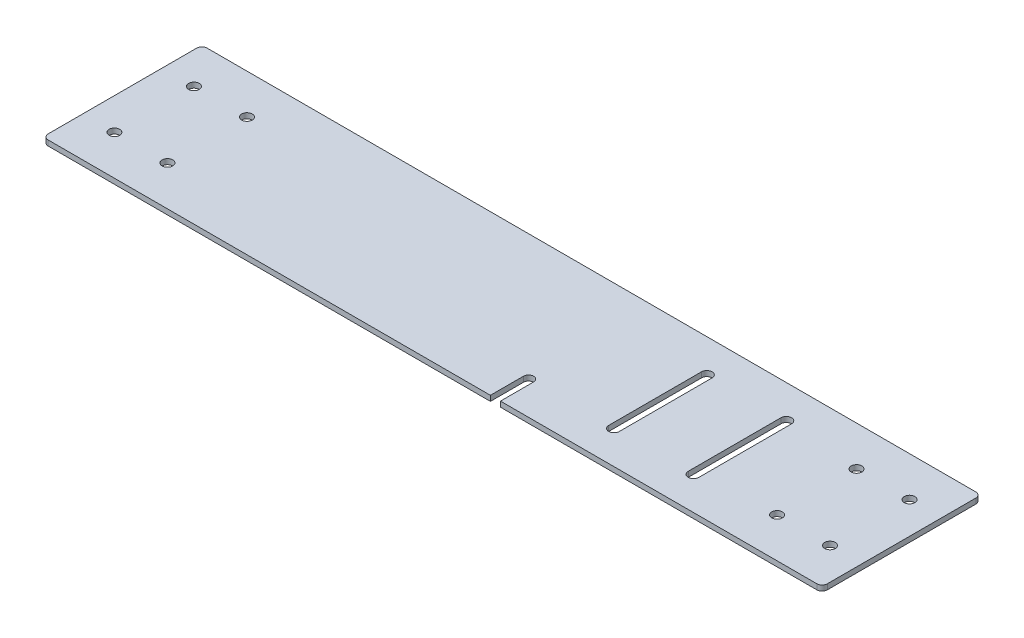
ISO-10303-21;
HEADER;
FILE_DESCRIPTION(('STEP AP214'),'2;1');
FILE_NAME('part.step','',(''),(''),'','','');
FILE_SCHEMA(('AUTOMOTIVE_DESIGN { 1 0 10303 214 1 1 1 1 }'));
ENDSEC;
DATA;
#1=APPLICATION_CONTEXT('core data for automotive mechanical design processes');
#2=APPLICATION_PROTOCOL_DEFINITION('international standard','automotive_design',2000,#1);
#3=PRODUCT_CONTEXT('',#1,'mechanical');
#4=PRODUCT('Part','Part','',(#3));
#5=PRODUCT_RELATED_PRODUCT_CATEGORY('part','',(#4));
#6=PRODUCT_DEFINITION_FORMATION('','',#4);
#7=PRODUCT_DEFINITION_CONTEXT('part definition',#1,'design');
#8=PRODUCT_DEFINITION('design','',#6,#7);
#9=PRODUCT_DEFINITION_SHAPE('','',#8);
#10=(LENGTH_UNIT() NAMED_UNIT(*) SI_UNIT(.MILLI.,.METRE.));
#11=(NAMED_UNIT(*) PLANE_ANGLE_UNIT() SI_UNIT($,.RADIAN.));
#12=(NAMED_UNIT(*) SI_UNIT($,.STERADIAN.) SOLID_ANGLE_UNIT());
#13=UNCERTAINTY_MEASURE_WITH_UNIT(LENGTH_MEASURE(1.E-05),#10,'distance_accuracy_value','');
#14=(GEOMETRIC_REPRESENTATION_CONTEXT(3) GLOBAL_UNCERTAINTY_ASSIGNED_CONTEXT((#13)) GLOBAL_UNIT_ASSIGNED_CONTEXT((#10,
#11,#12)) REPRESENTATION_CONTEXT('',''));
#15=CARTESIAN_POINT('',(0.,0.,0.));
#16=DIRECTION('',(0.,0.,1.));
#17=DIRECTION('',(1.,0.,0.));
#18=AXIS2_PLACEMENT_3D('',#15,#16,#17);
#19=CARTESIAN_POINT('',(0.,2.,30.));
#20=DIRECTION('',(0.,0.,-1.));
#21=DIRECTION('',(-1.,0.,0.));
#22=AXIS2_PLACEMENT_3D('',#19,#20,#21);
#23=PLANE('',#22);
#24=DIRECTION('',(1.,0.,0.));
#25=VECTOR('',#24,1.);
#26=CARTESIAN_POINT('',(0.,0.,30.));
#27=LINE('',#26,#25);
#28=CARTESIAN_POINT('',(-145.,0.,30.));
#29=VERTEX_POINT('',#28);
#30=CARTESIAN_POINT('',(21.85,0.,30.));
#31=VERTEX_POINT('',#30);
#32=EDGE_CURVE('E301',#29,#31,#27,.T.);
#33=ORIENTED_EDGE('',*,*,#32,.T.);
#34=DIRECTION('',(0.,-1.,0.));
#35=VECTOR('',#34,1.);
#36=CARTESIAN_POINT('',(21.85,-8.,30.));
#37=LINE('',#36,#35);
#38=CARTESIAN_POINT('',(21.85,2.,30.));
#39=VERTEX_POINT('',#38);
#40=EDGE_CURVE('E199',#39,#31,#37,.T.);
#41=ORIENTED_EDGE('',*,*,#40,.F.);
#42=DIRECTION('',(1.,0.,0.));
#43=VECTOR('',#42,1.);
#44=CARTESIAN_POINT('',(0.,2.,30.));
#45=LINE('',#44,#43);
#46=CARTESIAN_POINT('',(-145.,2.,30.));
#47=VERTEX_POINT('',#46);
#48=EDGE_CURVE('E190',#47,#39,#45,.T.);
#49=ORIENTED_EDGE('',*,*,#48,.F.);
#50=DIRECTION('',(0.,-1.,0.));
#51=VECTOR('',#50,1.);
#52=CARTESIAN_POINT('',(-145.,2.,30.));
#53=LINE('',#52,#51);
#54=EDGE_CURVE('E385',#47,#29,#53,.T.);
#55=ORIENTED_EDGE('',*,*,#54,.T.);
#56=EDGE_LOOP('',(#33,#41,#49,#55));
#57=FACE_BOUND('',#56,.T.);
#58=ADVANCED_FACE('F45',(#57),#23,.F.);
#59=CARTESIAN_POINT('',(0.,2.,30.));
#60=DIRECTION('',(0.,0.,-1.));
#61=DIRECTION('',(-1.,0.,0.));
#62=AXIS2_PLACEMENT_3D('',#59,#60,#61);
#63=PLANE('',#62);
#64=DIRECTION('',(0.,-1.,0.));
#65=VECTOR('',#64,1.);
#66=CARTESIAN_POINT('',(145.,2.,30.));
#67=LINE('',#66,#65);
#68=CARTESIAN_POINT('',(145.,0.,30.));
#69=VERTEX_POINT('',#68);
#70=CARTESIAN_POINT('',(145.,2.,30.));
#71=VERTEX_POINT('',#70);
#72=EDGE_CURVE('E11',#69,#71,#67,.F.);
#73=ORIENTED_EDGE('',*,*,#72,.T.);
#74=DIRECTION('',(1.,0.,0.));
#75=VECTOR('',#74,1.);
#76=CARTESIAN_POINT('',(0.,2.,30.));
#77=LINE('',#76,#75);
#78=CARTESIAN_POINT('',(25.65,2.,30.));
#79=VERTEX_POINT('',#78);
#80=EDGE_CURVE('E180',#79,#71,#77,.T.);
#81=ORIENTED_EDGE('',*,*,#80,.F.);
#82=DIRECTION('',(0.,1.,0.));
#83=VECTOR('',#82,1.);
#84=CARTESIAN_POINT('',(25.65,-8.,30.));
#85=LINE('',#84,#83);
#86=CARTESIAN_POINT('',(25.65,0.,30.));
#87=VERTEX_POINT('',#86);
#88=EDGE_CURVE('E183',#87,#79,#85,.T.);
#89=ORIENTED_EDGE('',*,*,#88,.F.);
#90=DIRECTION('',(1.,0.,0.));
#91=VECTOR('',#90,1.);
#92=CARTESIAN_POINT('',(0.,0.,30.));
#93=LINE('',#92,#91);
#94=EDGE_CURVE('E304',#87,#69,#93,.T.);
#95=ORIENTED_EDGE('',*,*,#94,.T.);
#96=EDGE_LOOP('',(#73,#81,#89,#95));
#97=FACE_BOUND('',#96,.T.);
#98=ADVANCED_FACE('F182',(#97),#63,.F.);
#99=CARTESIAN_POINT('',(147.,2.,0.));
#100=DIRECTION('',(1.,0.,0.));
#101=DIRECTION('',(0.,0.,-1.));
#102=AXIS2_PLACEMENT_3D('',#99,#100,#101);
#103=PLANE('',#102);
#104=DIRECTION('',(0.,0.,1.));
#105=VECTOR('',#104,1.);
#106=CARTESIAN_POINT('',(147.,0.,0.));
#107=LINE('',#106,#105);
#108=CARTESIAN_POINT('',(147.,0.,-28.));
#109=VERTEX_POINT('',#108);
#110=CARTESIAN_POINT('',(147.,0.,28.));
#111=VERTEX_POINT('',#110);
#112=EDGE_CURVE('E308',#109,#111,#107,.T.);
#113=ORIENTED_EDGE('',*,*,#112,.F.);
#114=DIRECTION('',(0.,-1.,0.));
#115=VECTOR('',#114,1.);
#116=CARTESIAN_POINT('',(147.,2.,-28.));
#117=LINE('',#116,#115);
#118=CARTESIAN_POINT('',(147.,2.,-28.));
#119=VERTEX_POINT('',#118);
#120=EDGE_CURVE('E54',#109,#119,#117,.F.);
#121=ORIENTED_EDGE('',*,*,#120,.T.);
#122=DIRECTION('',(0.,0.,1.));
#123=VECTOR('',#122,1.);
#124=CARTESIAN_POINT('',(147.,2.,0.));
#125=LINE('',#124,#123);
#126=CARTESIAN_POINT('',(147.,2.,28.));
#127=VERTEX_POINT('',#126);
#128=EDGE_CURVE('E189',#119,#127,#125,.T.);
#129=ORIENTED_EDGE('',*,*,#128,.T.);
#130=DIRECTION('',(0.,-1.,0.));
#131=VECTOR('',#130,1.);
#132=CARTESIAN_POINT('',(147.,0.,28.));
#133=LINE('',#132,#131);
#134=EDGE_CURVE('E427',#127,#111,#133,.T.);
#135=ORIENTED_EDGE('',*,*,#134,.T.);
#136=EDGE_LOOP('',(#113,#121,#129,#135));
#137=FACE_BOUND('',#136,.T.);
#138=ADVANCED_FACE('F436',(#137),#103,.T.);
#139=CARTESIAN_POINT('',(0.,2.,-30.));
#140=DIRECTION('',(0.,0.,-1.));
#141=DIRECTION('',(-1.,0.,0.));
#142=AXIS2_PLACEMENT_3D('',#139,#140,#141);
#143=PLANE('',#142);
#144=DIRECTION('',(0.,-1.,0.));
#145=VECTOR('',#144,1.);
#146=CARTESIAN_POINT('',(-145.,2.,-30.));
#147=LINE('',#146,#145);
#148=CARTESIAN_POINT('',(-145.,0.,-30.));
#149=VERTEX_POINT('',#148);
#150=CARTESIAN_POINT('',(-145.,2.,-30.));
#151=VERTEX_POINT('',#150);
#152=EDGE_CURVE('E421',#149,#151,#147,.F.);
#153=ORIENTED_EDGE('',*,*,#152,.T.);
#154=DIRECTION('',(1.,0.,0.));
#155=VECTOR('',#154,1.);
#156=CARTESIAN_POINT('',(0.,2.,-30.));
#157=LINE('',#156,#155);
#158=CARTESIAN_POINT('',(145.,2.,-30.));
#159=VERTEX_POINT('',#158);
#160=EDGE_CURVE('E61',#151,#159,#157,.T.);
#161=ORIENTED_EDGE('',*,*,#160,.T.);
#162=DIRECTION('',(0.,-1.,0.));
#163=VECTOR('',#162,1.);
#164=CARTESIAN_POINT('',(145.,2.,-30.));
#165=LINE('',#164,#163);
#166=CARTESIAN_POINT('',(145.,0.,-30.));
#167=VERTEX_POINT('',#166);
#168=EDGE_CURVE('E424',#159,#167,#165,.T.);
#169=ORIENTED_EDGE('',*,*,#168,.T.);
#170=DIRECTION('',(1.,0.,0.));
#171=VECTOR('',#170,1.);
#172=CARTESIAN_POINT('',(0.,0.,-30.));
#173=LINE('',#172,#171);
#174=EDGE_CURVE('E312',#149,#167,#173,.T.);
#175=ORIENTED_EDGE('',*,*,#174,.F.);
#176=EDGE_LOOP('',(#153,#161,#169,#175));
#177=FACE_BOUND('',#176,.T.);
#178=ADVANCED_FACE('F444',(#177),#143,.T.);
#179=CARTESIAN_POINT('',(-147.,2.,0.));
#180=DIRECTION('',(1.,0.,0.));
#181=DIRECTION('',(0.,0.,-1.));
#182=AXIS2_PLACEMENT_3D('',#179,#180,#181);
#183=PLANE('',#182);
#184=DIRECTION('',(0.,0.,1.));
#185=VECTOR('',#184,1.);
#186=CARTESIAN_POINT('',(-147.,0.,0.));
#187=LINE('',#186,#185);
#188=CARTESIAN_POINT('',(-147.,0.,-28.));
#189=VERTEX_POINT('',#188);
#190=CARTESIAN_POINT('',(-147.,0.,28.));
#191=VERTEX_POINT('',#190);
#192=EDGE_CURVE('E289',#189,#191,#187,.T.);
#193=ORIENTED_EDGE('',*,*,#192,.T.);
#194=DIRECTION('',(0.,-1.,0.));
#195=VECTOR('',#194,1.);
#196=CARTESIAN_POINT('',(-147.,2.,28.));
#197=LINE('',#196,#195);
#198=CARTESIAN_POINT('',(-147.,2.,28.));
#199=VERTEX_POINT('',#198);
#200=EDGE_CURVE('E406',#191,#199,#197,.F.);
#201=ORIENTED_EDGE('',*,*,#200,.T.);
#202=DIRECTION('',(0.,0.,1.));
#203=VECTOR('',#202,1.);
#204=CARTESIAN_POINT('',(-147.,2.,0.));
#205=LINE('',#204,#203);
#206=CARTESIAN_POINT('',(-147.,2.,-28.));
#207=VERTEX_POINT('',#206);
#208=EDGE_CURVE('E296',#207,#199,#205,.T.);
#209=ORIENTED_EDGE('',*,*,#208,.F.);
#210=DIRECTION('',(0.,-1.,0.));
#211=VECTOR('',#210,1.);
#212=CARTESIAN_POINT('',(-147.,0.,-28.));
#213=LINE('',#212,#211);
#214=EDGE_CURVE('E402',#207,#189,#213,.T.);
#215=ORIENTED_EDGE('',*,*,#214,.T.);
#216=EDGE_LOOP('',(#193,#201,#209,#215));
#217=FACE_BOUND('',#216,.T.);
#218=ADVANCED_FACE('F454',(#217),#183,.F.);
#219=CARTESIAN_POINT('',(0.,2.,0.));
#220=DIRECTION('',(0.,1.,0.));
#221=DIRECTION('',(0.,0.,1.));
#222=AXIS2_PLACEMENT_3D('',#219,#220,#221);
#223=PLANE('',#222);
#224=ORIENTED_EDGE('',*,*,#160,.F.);
#225=CARTESIAN_POINT('',(-145.,2.,-28.));
#226=DIRECTION('',(0.,1.,0.));
#227=DIRECTION('',(0.,0.,1.));
#228=AXIS2_PLACEMENT_3D('',#225,#226,#227);
#229=CIRCLE('',#228,2.);
#230=EDGE_CURVE('E415',#151,#207,#229,.T.);
#231=ORIENTED_EDGE('',*,*,#230,.T.);
#232=ORIENTED_EDGE('',*,*,#208,.T.);
#233=CARTESIAN_POINT('',(-145.,2.,28.));
#234=DIRECTION('',(0.,1.,0.));
#235=DIRECTION('',(0.,0.,1.));
#236=AXIS2_PLACEMENT_3D('',#233,#234,#235);
#237=CIRCLE('',#236,2.);
#238=EDGE_CURVE('E418',#199,#47,#237,.T.);
#239=ORIENTED_EDGE('',*,*,#238,.T.);
#240=ORIENTED_EDGE('',*,*,#48,.T.);
#241=DIRECTION('',(0.,0.,1.));
#242=VECTOR('',#241,1.);
#243=CARTESIAN_POINT('',(21.85,2.,17.5));
#244=LINE('',#243,#242);
#245=CARTESIAN_POINT('',(21.85,2.,17.5));
#246=VERTEX_POINT('',#245);
#247=EDGE_CURVE('E207',#246,#39,#244,.T.);
#248=ORIENTED_EDGE('',*,*,#247,.F.);
#249=CARTESIAN_POINT('',(23.75,2.,17.5));
#250=DIRECTION('',(0.,1.,0.));
#251=DIRECTION('',(0.,0.,1.));
#252=AXIS2_PLACEMENT_3D('',#249,#250,#251);
#253=CIRCLE('',#252,1.9);
#254=CARTESIAN_POINT('',(25.65,2.,17.5));
#255=VERTEX_POINT('',#254);
#256=EDGE_CURVE('E205',#255,#246,#253,.T.);
#257=ORIENTED_EDGE('',*,*,#256,.F.);
#258=DIRECTION('',(0.,0.,-1.));
#259=VECTOR('',#258,1.);
#260=CARTESIAN_POINT('',(25.65,2.,17.5));
#261=LINE('',#260,#259);
#262=EDGE_CURVE('E195',#79,#255,#261,.T.);
#263=ORIENTED_EDGE('',*,*,#262,.F.);
#264=ORIENTED_EDGE('',*,*,#80,.T.);
#265=CARTESIAN_POINT('',(145.,2.,28.));
#266=DIRECTION('',(0.,1.,0.));
#267=DIRECTION('',(0.,0.,1.));
#268=AXIS2_PLACEMENT_3D('',#265,#266,#267);
#269=CIRCLE('',#268,2.);
#270=EDGE_CURVE('E409',#71,#127,#269,.T.);
#271=ORIENTED_EDGE('',*,*,#270,.T.);
#272=ORIENTED_EDGE('',*,*,#128,.F.);
#273=CARTESIAN_POINT('',(145.,2.,-28.));
#274=DIRECTION('',(0.,1.,0.));
#275=DIRECTION('',(0.,0.,1.));
#276=AXIS2_PLACEMENT_3D('',#273,#274,#275);
#277=CIRCLE('',#276,2.);
#278=EDGE_CURVE('E412',#119,#159,#277,.T.);
#279=ORIENTED_EDGE('',*,*,#278,.T.);
#280=EDGE_LOOP('',(#224,#231,#232,#239,#240,#248,#257,#263,#264,#271,#272,#279));
#281=FACE_BOUND('',#280,.T.);
#282=CARTESIAN_POINT('',(86.,2.,17.5));
#283=DIRECTION('',(0.,1.,0.));
#284=DIRECTION('',(0.,0.,1.));
#285=AXIS2_PLACEMENT_3D('',#282,#283,#284);
#286=CIRCLE('',#285,2.);
#287=CARTESIAN_POINT('',(84.,2.,17.5));
#288=VERTEX_POINT('',#287);
#289=CARTESIAN_POINT('',(88.,2.,17.5));
#290=VERTEX_POINT('',#289);
#291=EDGE_CURVE('E228',#288,#290,#286,.T.);
#292=ORIENTED_EDGE('',*,*,#291,.F.);
#293=DIRECTION('',(0.,0.,1.));
#294=VECTOR('',#293,1.);
#295=CARTESIAN_POINT('',(84.,2.,17.5));
#296=LINE('',#295,#294);
#297=CARTESIAN_POINT('',(84.,2.,-17.5));
#298=VERTEX_POINT('',#297);
#299=EDGE_CURVE('E871',#298,#288,#296,.T.);
#300=ORIENTED_EDGE('',*,*,#299,.F.);
#301=CARTESIAN_POINT('',(86.,2.,-17.5));
#302=DIRECTION('',(0.,1.,0.));
#303=DIRECTION('',(0.,0.,1.));
#304=AXIS2_PLACEMENT_3D('',#301,#302,#303);
#305=CIRCLE('',#304,2.);
#306=CARTESIAN_POINT('',(88.,2.,-17.5));
#307=VERTEX_POINT('',#306);
#308=EDGE_CURVE('E876',#307,#298,#305,.T.);
#309=ORIENTED_EDGE('',*,*,#308,.F.);
#310=DIRECTION('',(0.,0.,-1.));
#311=VECTOR('',#310,1.);
#312=CARTESIAN_POINT('',(88.,2.,17.5));
#313=LINE('',#312,#311);
#314=EDGE_CURVE('E881',#290,#307,#313,.T.);
#315=ORIENTED_EDGE('',*,*,#314,.F.);
#316=EDGE_LOOP('',(#292,#300,#309,#315));
#317=FACE_BOUND('',#316,.T.);
#318=CARTESIAN_POINT('',(56.,2.,-17.5));
#319=DIRECTION('',(0.,1.,0.));
#320=DIRECTION('',(0.,0.,1.));
#321=AXIS2_PLACEMENT_3D('',#318,#319,#320);
#322=CIRCLE('',#321,2.);
#323=CARTESIAN_POINT('',(58.,2.,-17.5));
#324=VERTEX_POINT('',#323);
#325=CARTESIAN_POINT('',(54.,2.,-17.5));
#326=VERTEX_POINT('',#325);
#327=EDGE_CURVE('E224',#324,#326,#322,.T.);
#328=ORIENTED_EDGE('',*,*,#327,.F.);
#329=DIRECTION('',(0.,0.,-1.));
#330=VECTOR('',#329,1.);
#331=CARTESIAN_POINT('',(58.,2.,17.5));
#332=LINE('',#331,#330);
#333=CARTESIAN_POINT('',(58.,2.,17.5));
#334=VERTEX_POINT('',#333);
#335=EDGE_CURVE('E236',#334,#324,#332,.T.);
#336=ORIENTED_EDGE('',*,*,#335,.F.);
#337=CARTESIAN_POINT('',(56.,2.,17.5));
#338=DIRECTION('',(0.,1.,0.));
#339=DIRECTION('',(0.,0.,1.));
#340=AXIS2_PLACEMENT_3D('',#337,#338,#339);
#341=CIRCLE('',#340,2.);
#342=CARTESIAN_POINT('',(54.,2.,17.5));
#343=VERTEX_POINT('',#342);
#344=EDGE_CURVE('E232',#343,#334,#341,.T.);
#345=ORIENTED_EDGE('',*,*,#344,.F.);
#346=DIRECTION('',(0.,0.,1.));
#347=VECTOR('',#346,1.);
#348=CARTESIAN_POINT('',(54.,2.,17.5));
#349=LINE('',#348,#347);
#350=EDGE_CURVE('E227',#326,#343,#349,.T.);
#351=ORIENTED_EDGE('',*,*,#350,.F.);
#352=EDGE_LOOP('',(#328,#336,#345,#351));
#353=FACE_BOUND('',#352,.T.);
#354=CARTESIAN_POINT('',(115.,2.,-15.));
#355=DIRECTION('',(0.,-1.,0.));
#356=DIRECTION('',(0.,0.,1.));
#357=AXIS2_PLACEMENT_3D('',#354,#355,#356);
#358=CIRCLE('',#357,2.);
#359=CARTESIAN_POINT('',(115.,2.,-13.));
#360=VERTEX_POINT('',#359);
#361=EDGE_CURVE('E258',#360,#360,#358,.T.);
#362=ORIENTED_EDGE('',*,*,#361,.T.);
#363=EDGE_LOOP('',(#362));
#364=FACE_BOUND('',#363,.T.);
#365=CARTESIAN_POINT('',(135.,2.,15.));
#366=DIRECTION('',(0.,-1.,0.));
#367=DIRECTION('',(0.,0.,1.));
#368=AXIS2_PLACEMENT_3D('',#365,#366,#367);
#369=CIRCLE('',#368,2.);
#370=CARTESIAN_POINT('',(135.,2.,17.));
#371=VERTEX_POINT('',#370);
#372=EDGE_CURVE('E257',#371,#371,#369,.T.);
#373=ORIENTED_EDGE('',*,*,#372,.T.);
#374=EDGE_LOOP('',(#373));
#375=FACE_BOUND('',#374,.T.);
#376=CARTESIAN_POINT('',(115.,2.,15.));
#377=DIRECTION('',(0.,-1.,0.));
#378=DIRECTION('',(0.,0.,1.));
#379=AXIS2_PLACEMENT_3D('',#376,#377,#378);
#380=CIRCLE('',#379,2.);
#381=CARTESIAN_POINT('',(115.,2.,17.));
#382=VERTEX_POINT('',#381);
#383=EDGE_CURVE('E244',#382,#382,#380,.T.);
#384=ORIENTED_EDGE('',*,*,#383,.T.);
#385=EDGE_LOOP('',(#384));
#386=FACE_BOUND('',#385,.T.);
#387=CARTESIAN_POINT('',(135.,2.,-15.));
#388=DIRECTION('',(0.,-1.,0.));
#389=DIRECTION('',(0.,0.,1.));
#390=AXIS2_PLACEMENT_3D('',#387,#388,#389);
#391=CIRCLE('',#390,2.);
#392=CARTESIAN_POINT('',(135.,2.,-13.));
#393=VERTEX_POINT('',#392);
#394=EDGE_CURVE('E262',#393,#393,#391,.T.);
#395=ORIENTED_EDGE('',*,*,#394,.T.);
#396=EDGE_LOOP('',(#395));
#397=FACE_BOUND('',#396,.T.);
#398=CARTESIAN_POINT('',(-115.,2.,-15.));
#399=DIRECTION('',(0.,1.,0.));
#400=DIRECTION('',(0.,0.,1.));
#401=AXIS2_PLACEMENT_3D('',#398,#399,#400);
#402=CIRCLE('',#401,2.);
#403=CARTESIAN_POINT('',(-115.,2.,-13.));
#404=VERTEX_POINT('',#403);
#405=EDGE_CURVE('E276',#404,#404,#402,.T.);
#406=ORIENTED_EDGE('',*,*,#405,.F.);
#407=EDGE_LOOP('',(#406));
#408=FACE_BOUND('',#407,.T.);
#409=CARTESIAN_POINT('',(-135.,2.,15.));
#410=DIRECTION('',(0.,1.,0.));
#411=DIRECTION('',(0.,0.,1.));
#412=AXIS2_PLACEMENT_3D('',#409,#410,#411);
#413=CIRCLE('',#412,2.);
#414=CARTESIAN_POINT('',(-135.,2.,17.));
#415=VERTEX_POINT('',#414);
#416=EDGE_CURVE('E274',#415,#415,#413,.T.);
#417=ORIENTED_EDGE('',*,*,#416,.F.);
#418=EDGE_LOOP('',(#417));
#419=FACE_BOUND('',#418,.T.);
#420=CARTESIAN_POINT('',(-115.,2.,15.));
#421=DIRECTION('',(0.,1.,0.));
#422=DIRECTION('',(0.,0.,1.));
#423=AXIS2_PLACEMENT_3D('',#420,#421,#422);
#424=CIRCLE('',#423,2.);
#425=CARTESIAN_POINT('',(-115.,2.,17.));
#426=VERTEX_POINT('',#425);
#427=EDGE_CURVE('E270',#426,#426,#424,.T.);
#428=ORIENTED_EDGE('',*,*,#427,.F.);
#429=EDGE_LOOP('',(#428));
#430=FACE_BOUND('',#429,.T.);
#431=CARTESIAN_POINT('',(-135.,2.,-15.));
#432=DIRECTION('',(0.,1.,0.));
#433=DIRECTION('',(0.,0.,1.));
#434=AXIS2_PLACEMENT_3D('',#431,#432,#433);
#435=CIRCLE('',#434,2.);
#436=CARTESIAN_POINT('',(-135.,2.,-13.));
#437=VERTEX_POINT('',#436);
#438=EDGE_CURVE('E280',#437,#437,#435,.T.);
#439=ORIENTED_EDGE('',*,*,#438,.F.);
#440=EDGE_LOOP('',(#439));
#441=FACE_BOUND('',#440,.T.);
#442=ADVANCED_FACE('F202',(#281,#317,#353,#364,#375,#386,#397,#408,#419,#430,#441),#223,.T.);
#443=CARTESIAN_POINT('',(0.,0.,0.));
#444=DIRECTION('',(0.,1.,0.));
#445=DIRECTION('',(0.,0.,1.));
#446=AXIS2_PLACEMENT_3D('',#443,#444,#445);
#447=PLANE('',#446);
#448=ORIENTED_EDGE('',*,*,#174,.T.);
#449=CARTESIAN_POINT('',(145.,0.,-28.));
#450=DIRECTION('',(0.,1.,0.));
#451=DIRECTION('',(0.,0.,1.));
#452=AXIS2_PLACEMENT_3D('',#449,#450,#451);
#453=CIRCLE('',#452,2.);
#454=EDGE_CURVE('E393',#167,#109,#453,.F.);
#455=ORIENTED_EDGE('',*,*,#454,.T.);
#456=ORIENTED_EDGE('',*,*,#112,.T.);
#457=CARTESIAN_POINT('',(145.,0.,28.));
#458=DIRECTION('',(0.,1.,0.));
#459=DIRECTION('',(0.,0.,1.));
#460=AXIS2_PLACEMENT_3D('',#457,#458,#459);
#461=CIRCLE('',#460,2.);
#462=EDGE_CURVE('E389',#111,#69,#461,.F.);
#463=ORIENTED_EDGE('',*,*,#462,.T.);
#464=ORIENTED_EDGE('',*,*,#94,.F.);
#465=DIRECTION('',(0.,0.,-1.));
#466=VECTOR('',#465,1.);
#467=CARTESIAN_POINT('',(25.65,0.,0.));
#468=LINE('',#467,#466);
#469=CARTESIAN_POINT('',(25.65,0.,17.5));
#470=VERTEX_POINT('',#469);
#471=EDGE_CURVE('E197',#87,#470,#468,.T.);
#472=ORIENTED_EDGE('',*,*,#471,.T.);
#473=CARTESIAN_POINT('',(23.75,0.,17.5));
#474=DIRECTION('',(0.,1.,0.));
#475=DIRECTION('',(0.,0.,1.));
#476=AXIS2_PLACEMENT_3D('',#473,#474,#475);
#477=CIRCLE('',#476,1.9);
#478=CARTESIAN_POINT('',(21.85,0.,17.5));
#479=VERTEX_POINT('',#478);
#480=EDGE_CURVE('E381',#470,#479,#477,.T.);
#481=ORIENTED_EDGE('',*,*,#480,.T.);
#482=DIRECTION('',(0.,0.,1.));
#483=VECTOR('',#482,1.);
#484=CARTESIAN_POINT('',(21.85,0.,0.));
#485=LINE('',#484,#483);
#486=EDGE_CURVE('E375',#479,#31,#485,.T.);
#487=ORIENTED_EDGE('',*,*,#486,.T.);
#488=ORIENTED_EDGE('',*,*,#32,.F.);
#489=CARTESIAN_POINT('',(-145.,0.,28.));
#490=DIRECTION('',(0.,1.,0.));
#491=DIRECTION('',(0.,0.,1.));
#492=AXIS2_PLACEMENT_3D('',#489,#490,#491);
#493=CIRCLE('',#492,2.);
#494=EDGE_CURVE('E399',#29,#191,#493,.F.);
#495=ORIENTED_EDGE('',*,*,#494,.T.);
#496=ORIENTED_EDGE('',*,*,#192,.F.);
#497=CARTESIAN_POINT('',(-145.,0.,-28.));
#498=DIRECTION('',(0.,1.,0.));
#499=DIRECTION('',(0.,0.,1.));
#500=AXIS2_PLACEMENT_3D('',#497,#498,#499);
#501=CIRCLE('',#500,2.);
#502=EDGE_CURVE('E396',#189,#149,#501,.F.);
#503=ORIENTED_EDGE('',*,*,#502,.T.);
#504=EDGE_LOOP('',(#448,#455,#456,#463,#464,#472,#481,#487,#488,#495,#496,#503));
#505=FACE_BOUND('',#504,.T.);
#506=DIRECTION('',(0.,0.,1.));
#507=VECTOR('',#506,1.);
#508=CARTESIAN_POINT('',(84.,0.,0.));
#509=LINE('',#508,#507);
#510=CARTESIAN_POINT('',(84.,0.,-17.5));
#511=VERTEX_POINT('',#510);
#512=CARTESIAN_POINT('',(84.,0.,17.5));
#513=VERTEX_POINT('',#512);
#514=EDGE_CURVE('E367',#511,#513,#509,.T.);
#515=ORIENTED_EDGE('',*,*,#514,.T.);
#516=CARTESIAN_POINT('',(86.,0.,17.5));
#517=DIRECTION('',(0.,1.,0.));
#518=DIRECTION('',(0.,0.,1.));
#519=AXIS2_PLACEMENT_3D('',#516,#517,#518);
#520=CIRCLE('',#519,2.);
#521=CARTESIAN_POINT('',(88.,0.,17.5));
#522=VERTEX_POINT('',#521);
#523=EDGE_CURVE('E371',#513,#522,#520,.T.);
#524=ORIENTED_EDGE('',*,*,#523,.T.);
#525=DIRECTION('',(0.,0.,-1.));
#526=VECTOR('',#525,1.);
#527=CARTESIAN_POINT('',(88.,0.,0.));
#528=LINE('',#527,#526);
#529=CARTESIAN_POINT('',(88.,0.,-17.5));
#530=VERTEX_POINT('',#529);
#531=EDGE_CURVE('E359',#522,#530,#528,.T.);
#532=ORIENTED_EDGE('',*,*,#531,.T.);
#533=CARTESIAN_POINT('',(86.,0.,-17.5));
#534=DIRECTION('',(0.,1.,0.));
#535=DIRECTION('',(0.,0.,1.));
#536=AXIS2_PLACEMENT_3D('',#533,#534,#535);
#537=CIRCLE('',#536,2.);
#538=EDGE_CURVE('E363',#530,#511,#537,.T.);
#539=ORIENTED_EDGE('',*,*,#538,.T.);
#540=EDGE_LOOP('',(#515,#524,#532,#539));
#541=FACE_BOUND('',#540,.T.);
#542=DIRECTION('',(0.,0.,-1.));
#543=VECTOR('',#542,1.);
#544=CARTESIAN_POINT('',(58.,0.,0.));
#545=LINE('',#544,#543);
#546=CARTESIAN_POINT('',(58.,0.,17.5));
#547=VERTEX_POINT('',#546);
#548=CARTESIAN_POINT('',(58.,0.,-17.5));
#549=VERTEX_POINT('',#548);
#550=EDGE_CURVE('E351',#547,#549,#545,.T.);
#551=ORIENTED_EDGE('',*,*,#550,.T.);
#552=CARTESIAN_POINT('',(56.,0.,-17.5));
#553=DIRECTION('',(0.,1.,0.));
#554=DIRECTION('',(0.,0.,1.));
#555=AXIS2_PLACEMENT_3D('',#552,#553,#554);
#556=CIRCLE('',#555,2.);
#557=CARTESIAN_POINT('',(54.,0.,-17.5));
#558=VERTEX_POINT('',#557);
#559=EDGE_CURVE('E355',#549,#558,#556,.T.);
#560=ORIENTED_EDGE('',*,*,#559,.T.);
#561=DIRECTION('',(0.,0.,1.));
#562=VECTOR('',#561,1.);
#563=CARTESIAN_POINT('',(54.,0.,0.));
#564=LINE('',#563,#562);
#565=CARTESIAN_POINT('',(54.,0.,17.5));
#566=VERTEX_POINT('',#565);
#567=EDGE_CURVE('E300',#558,#566,#564,.T.);
#568=ORIENTED_EDGE('',*,*,#567,.T.);
#569=CARTESIAN_POINT('',(56.,0.,17.5));
#570=DIRECTION('',(0.,1.,0.));
#571=DIRECTION('',(0.,0.,1.));
#572=AXIS2_PLACEMENT_3D('',#569,#570,#571);
#573=CIRCLE('',#572,2.);
#574=EDGE_CURVE('E347',#566,#547,#573,.T.);
#575=ORIENTED_EDGE('',*,*,#574,.T.);
#576=EDGE_LOOP('',(#551,#560,#568,#575));
#577=FACE_BOUND('',#576,.T.);
#578=CARTESIAN_POINT('',(115.,0.,-15.));
#579=DIRECTION('',(0.,1.,0.));
#580=DIRECTION('',(0.,0.,1.));
#581=AXIS2_PLACEMENT_3D('',#578,#579,#580);
#582=CIRCLE('',#581,2.);
#583=CARTESIAN_POINT('',(115.,0.,-13.));
#584=VERTEX_POINT('',#583);
#585=EDGE_CURVE('E275',#584,#584,#582,.F.);
#586=ORIENTED_EDGE('',*,*,#585,.F.);
#587=EDGE_LOOP('',(#586));
#588=FACE_BOUND('',#587,.T.);
#589=CARTESIAN_POINT('',(135.,0.,15.));
#590=DIRECTION('',(0.,1.,0.));
#591=DIRECTION('',(0.,0.,1.));
#592=AXIS2_PLACEMENT_3D('',#589,#590,#591);
#593=CIRCLE('',#592,2.);
#594=CARTESIAN_POINT('',(135.,0.,17.));
#595=VERTEX_POINT('',#594);
#596=EDGE_CURVE('E337',#595,#595,#593,.F.);
#597=ORIENTED_EDGE('',*,*,#596,.F.);
#598=EDGE_LOOP('',(#597));
#599=FACE_BOUND('',#598,.T.);
#600=CARTESIAN_POINT('',(115.,0.,15.));
#601=DIRECTION('',(0.,1.,0.));
#602=DIRECTION('',(0.,0.,1.));
#603=AXIS2_PLACEMENT_3D('',#600,#601,#602);
#604=CIRCLE('',#603,2.);
#605=CARTESIAN_POINT('',(115.,0.,17.));
#606=VERTEX_POINT('',#605);
#607=EDGE_CURVE('E333',#606,#606,#604,.F.);
#608=ORIENTED_EDGE('',*,*,#607,.F.);
#609=EDGE_LOOP('',(#608));
#610=FACE_BOUND('',#609,.T.);
#611=CARTESIAN_POINT('',(135.,0.,-15.));
#612=DIRECTION('',(0.,1.,0.));
#613=DIRECTION('',(0.,0.,1.));
#614=AXIS2_PLACEMENT_3D('',#611,#612,#613);
#615=CIRCLE('',#614,2.);
#616=CARTESIAN_POINT('',(135.,0.,-13.));
#617=VERTEX_POINT('',#616);
#618=EDGE_CURVE('E269',#617,#617,#615,.F.);
#619=ORIENTED_EDGE('',*,*,#618,.F.);
#620=EDGE_LOOP('',(#619));
#621=FACE_BOUND('',#620,.T.);
#622=CARTESIAN_POINT('',(-115.,0.,-15.));
#623=DIRECTION('',(0.,1.,0.));
#624=DIRECTION('',(0.,0.,1.));
#625=AXIS2_PLACEMENT_3D('',#622,#623,#624);
#626=CIRCLE('',#625,2.);
#627=CARTESIAN_POINT('',(-115.,0.,-13.));
#628=VERTEX_POINT('',#627);
#629=EDGE_CURVE('E305',#628,#628,#626,.T.);
#630=ORIENTED_EDGE('',*,*,#629,.T.);
#631=EDGE_LOOP('',(#630));
#632=FACE_BOUND('',#631,.T.);
#633=CARTESIAN_POINT('',(-135.,0.,15.));
#634=DIRECTION('',(0.,1.,0.));
#635=DIRECTION('',(0.,0.,1.));
#636=AXIS2_PLACEMENT_3D('',#633,#634,#635);
#637=CIRCLE('',#636,2.);
#638=CARTESIAN_POINT('',(-135.,0.,17.));
#639=VERTEX_POINT('',#638);
#640=EDGE_CURVE('E324',#639,#639,#637,.T.);
#641=ORIENTED_EDGE('',*,*,#640,.T.);
#642=EDGE_LOOP('',(#641));
#643=FACE_BOUND('',#642,.T.);
#644=CARTESIAN_POINT('',(-115.,0.,15.));
#645=DIRECTION('',(0.,1.,0.));
#646=DIRECTION('',(0.,0.,1.));
#647=AXIS2_PLACEMENT_3D('',#644,#645,#646);
#648=CIRCLE('',#647,2.);
#649=CARTESIAN_POINT('',(-115.,0.,17.));
#650=VERTEX_POINT('',#649);
#651=EDGE_CURVE('E320',#650,#650,#648,.T.);
#652=ORIENTED_EDGE('',*,*,#651,.T.);
#653=EDGE_LOOP('',(#652));
#654=FACE_BOUND('',#653,.T.);
#655=CARTESIAN_POINT('',(-135.,0.,-15.));
#656=DIRECTION('',(0.,1.,0.));
#657=DIRECTION('',(0.,0.,1.));
#658=AXIS2_PLACEMENT_3D('',#655,#656,#657);
#659=CIRCLE('',#658,2.);
#660=CARTESIAN_POINT('',(-135.,0.,-13.));
#661=VERTEX_POINT('',#660);
#662=EDGE_CURVE('E287',#661,#661,#659,.T.);
#663=ORIENTED_EDGE('',*,*,#662,.T.);
#664=EDGE_LOOP('',(#663));
#665=FACE_BOUND('',#664,.T.);
#666=ADVANCED_FACE('F473',(#505,#541,#577,#588,#599,#610,#621,#632,#643,#654,#665),#447,.F.);
#667=CARTESIAN_POINT('',(-135.,-8.,-15.));
#668=DIRECTION('',(0.,1.,0.));
#669=DIRECTION('',(0.,0.,1.));
#670=AXIS2_PLACEMENT_3D('',#667,#668,#669);
#671=CYLINDRICAL_SURFACE('',#670,2.);
#672=ORIENTED_EDGE('',*,*,#438,.T.);
#673=EDGE_LOOP('',(#672));
#674=FACE_BOUND('',#673,.T.);
#675=ORIENTED_EDGE('',*,*,#662,.F.);
#676=EDGE_LOOP('',(#675));
#677=FACE_BOUND('',#676,.T.);
#678=ADVANCED_FACE('F540',(#674,#677),#671,.F.);
#679=CARTESIAN_POINT('',(-115.,-8.,15.));
#680=DIRECTION('',(0.,1.,0.));
#681=DIRECTION('',(0.,0.,1.));
#682=AXIS2_PLACEMENT_3D('',#679,#680,#681);
#683=CYLINDRICAL_SURFACE('',#682,2.);
#684=ORIENTED_EDGE('',*,*,#427,.T.);
#685=EDGE_LOOP('',(#684));
#686=FACE_BOUND('',#685,.T.);
#687=ORIENTED_EDGE('',*,*,#651,.F.);
#688=EDGE_LOOP('',(#687));
#689=FACE_BOUND('',#688,.T.);
#690=ADVANCED_FACE('F733',(#686,#689),#683,.F.);
#691=CARTESIAN_POINT('',(-135.,-8.,15.));
#692=DIRECTION('',(0.,1.,0.));
#693=DIRECTION('',(0.,0.,1.));
#694=AXIS2_PLACEMENT_3D('',#691,#692,#693);
#695=CYLINDRICAL_SURFACE('',#694,2.);
#696=ORIENTED_EDGE('',*,*,#416,.T.);
#697=EDGE_LOOP('',(#696));
#698=FACE_BOUND('',#697,.T.);
#699=ORIENTED_EDGE('',*,*,#640,.F.);
#700=EDGE_LOOP('',(#699));
#701=FACE_BOUND('',#700,.T.);
#702=ADVANCED_FACE('F723',(#698,#701),#695,.F.);
#703=CARTESIAN_POINT('',(-115.,-8.,-15.));
#704=DIRECTION('',(0.,1.,0.));
#705=DIRECTION('',(0.,0.,1.));
#706=AXIS2_PLACEMENT_3D('',#703,#704,#705);
#707=CYLINDRICAL_SURFACE('',#706,2.);
#708=ORIENTED_EDGE('',*,*,#405,.T.);
#709=EDGE_LOOP('',(#708));
#710=FACE_BOUND('',#709,.T.);
#711=ORIENTED_EDGE('',*,*,#629,.F.);
#712=EDGE_LOOP('',(#711));
#713=FACE_BOUND('',#712,.T.);
#714=ADVANCED_FACE('F713',(#710,#713),#707,.F.);
#715=CARTESIAN_POINT('',(135.,-8.,-15.));
#716=DIRECTION('',(0.,1.,0.));
#717=DIRECTION('',(0.,0.,1.));
#718=AXIS2_PLACEMENT_3D('',#715,#716,#717);
#719=CYLINDRICAL_SURFACE('',#718,2.);
#720=ORIENTED_EDGE('',*,*,#394,.F.);
#721=EDGE_LOOP('',(#720));
#722=FACE_BOUND('',#721,.T.);
#723=ORIENTED_EDGE('',*,*,#618,.T.);
#724=EDGE_LOOP('',(#723));
#725=FACE_BOUND('',#724,.T.);
#726=ADVANCED_FACE('F703',(#722,#725),#719,.F.);
#727=CARTESIAN_POINT('',(115.,-8.,15.));
#728=DIRECTION('',(0.,1.,0.));
#729=DIRECTION('',(0.,0.,1.));
#730=AXIS2_PLACEMENT_3D('',#727,#728,#729);
#731=CYLINDRICAL_SURFACE('',#730,2.);
#732=ORIENTED_EDGE('',*,*,#383,.F.);
#733=EDGE_LOOP('',(#732));
#734=FACE_BOUND('',#733,.T.);
#735=ORIENTED_EDGE('',*,*,#607,.T.);
#736=EDGE_LOOP('',(#735));
#737=FACE_BOUND('',#736,.T.);
#738=ADVANCED_FACE('F693',(#734,#737),#731,.F.);
#739=CARTESIAN_POINT('',(135.,-8.,15.));
#740=DIRECTION('',(0.,1.,0.));
#741=DIRECTION('',(0.,0.,1.));
#742=AXIS2_PLACEMENT_3D('',#739,#740,#741);
#743=CYLINDRICAL_SURFACE('',#742,2.);
#744=ORIENTED_EDGE('',*,*,#372,.F.);
#745=EDGE_LOOP('',(#744));
#746=FACE_BOUND('',#745,.T.);
#747=ORIENTED_EDGE('',*,*,#596,.T.);
#748=EDGE_LOOP('',(#747));
#749=FACE_BOUND('',#748,.T.);
#750=ADVANCED_FACE('F683',(#746,#749),#743,.F.);
#751=CARTESIAN_POINT('',(115.,-8.,-15.));
#752=DIRECTION('',(0.,1.,0.));
#753=DIRECTION('',(0.,0.,1.));
#754=AXIS2_PLACEMENT_3D('',#751,#752,#753);
#755=CYLINDRICAL_SURFACE('',#754,2.);
#756=ORIENTED_EDGE('',*,*,#361,.F.);
#757=EDGE_LOOP('',(#756));
#758=FACE_BOUND('',#757,.T.);
#759=ORIENTED_EDGE('',*,*,#585,.T.);
#760=EDGE_LOOP('',(#759));
#761=FACE_BOUND('',#760,.T.);
#762=ADVANCED_FACE('F673',(#758,#761),#755,.F.);
#763=CARTESIAN_POINT('',(56.,-8.,-17.5));
#764=DIRECTION('',(0.,1.,0.));
#765=DIRECTION('',(0.,0.,1.));
#766=AXIS2_PLACEMENT_3D('',#763,#764,#765);
#767=CYLINDRICAL_SURFACE('',#766,2.);
#768=DIRECTION('',(0.,1.,0.));
#769=VECTOR('',#768,1.);
#770=CARTESIAN_POINT('',(58.,-8.,-17.5));
#771=LINE('',#770,#769);
#772=EDGE_CURVE('E241',#549,#324,#771,.T.);
#773=ORIENTED_EDGE('',*,*,#772,.T.);
#774=ORIENTED_EDGE('',*,*,#327,.T.);
#775=DIRECTION('',(0.,1.,0.));
#776=VECTOR('',#775,1.);
#777=CARTESIAN_POINT('',(54.,-8.,-17.5));
#778=LINE('',#777,#776);
#779=EDGE_CURVE('E240',#558,#326,#778,.T.);
#780=ORIENTED_EDGE('',*,*,#779,.F.);
#781=ORIENTED_EDGE('',*,*,#559,.F.);
#782=EDGE_LOOP('',(#773,#774,#780,#781));
#783=FACE_BOUND('',#782,.T.);
#784=ADVANCED_FACE('F663',(#783),#767,.F.);
#785=CARTESIAN_POINT('',(58.,-8.,17.5));
#786=DIRECTION('',(1.,0.,0.));
#787=DIRECTION('',(0.,0.,-1.));
#788=AXIS2_PLACEMENT_3D('',#785,#786,#787);
#789=PLANE('',#788);
#790=DIRECTION('',(0.,1.,0.));
#791=VECTOR('',#790,1.);
#792=CARTESIAN_POINT('',(58.,-8.,17.5));
#793=LINE('',#792,#791);
#794=EDGE_CURVE('E245',#547,#334,#793,.T.);
#795=ORIENTED_EDGE('',*,*,#794,.T.);
#796=ORIENTED_EDGE('',*,*,#335,.T.);
#797=ORIENTED_EDGE('',*,*,#772,.F.);
#798=ORIENTED_EDGE('',*,*,#550,.F.);
#799=EDGE_LOOP('',(#795,#796,#797,#798));
#800=FACE_BOUND('',#799,.T.);
#801=ADVANCED_FACE('F653',(#800),#789,.F.);
#802=CARTESIAN_POINT('',(56.,-8.,17.5));
#803=DIRECTION('',(0.,1.,0.));
#804=DIRECTION('',(0.,0.,1.));
#805=AXIS2_PLACEMENT_3D('',#802,#803,#804);
#806=CYLINDRICAL_SURFACE('',#805,2.);
#807=DIRECTION('',(0.,1.,0.));
#808=VECTOR('',#807,1.);
#809=CARTESIAN_POINT('',(54.,-8.,17.5));
#810=LINE('',#809,#808);
#811=EDGE_CURVE('E248',#566,#343,#810,.T.);
#812=ORIENTED_EDGE('',*,*,#811,.T.);
#813=ORIENTED_EDGE('',*,*,#344,.T.);
#814=ORIENTED_EDGE('',*,*,#794,.F.);
#815=ORIENTED_EDGE('',*,*,#574,.F.);
#816=EDGE_LOOP('',(#812,#813,#814,#815));
#817=FACE_BOUND('',#816,.T.);
#818=ADVANCED_FACE('F643',(#817),#806,.F.);
#819=CARTESIAN_POINT('',(54.,-8.,17.5));
#820=DIRECTION('',(-1.,0.,0.));
#821=DIRECTION('',(0.,0.,1.));
#822=AXIS2_PLACEMENT_3D('',#819,#820,#821);
#823=PLANE('',#822);
#824=ORIENTED_EDGE('',*,*,#779,.T.);
#825=ORIENTED_EDGE('',*,*,#350,.T.);
#826=ORIENTED_EDGE('',*,*,#811,.F.);
#827=ORIENTED_EDGE('',*,*,#567,.F.);
#828=EDGE_LOOP('',(#824,#825,#826,#827));
#829=FACE_BOUND('',#828,.T.);
#830=ADVANCED_FACE('F633',(#829),#823,.F.);
#831=CARTESIAN_POINT('',(86.,-8.,17.5));
#832=DIRECTION('',(0.,1.,0.));
#833=DIRECTION('',(0.,0.,1.));
#834=AXIS2_PLACEMENT_3D('',#831,#832,#833);
#835=CYLINDRICAL_SURFACE('',#834,2.);
#836=DIRECTION('',(0.,1.,0.));
#837=VECTOR('',#836,1.);
#838=CARTESIAN_POINT('',(84.,-8.,17.5));
#839=LINE('',#838,#837);
#840=EDGE_CURVE('E223',#513,#288,#839,.T.);
#841=ORIENTED_EDGE('',*,*,#840,.T.);
#842=ORIENTED_EDGE('',*,*,#291,.T.);
#843=DIRECTION('',(0.,1.,0.));
#844=VECTOR('',#843,1.);
#845=CARTESIAN_POINT('',(88.,-8.,17.5));
#846=LINE('',#845,#844);
#847=EDGE_CURVE('E877',#522,#290,#846,.T.);
#848=ORIENTED_EDGE('',*,*,#847,.F.);
#849=ORIENTED_EDGE('',*,*,#523,.F.);
#850=EDGE_LOOP('',(#841,#842,#848,#849));
#851=FACE_BOUND('',#850,.T.);
#852=ADVANCED_FACE('F623',(#851),#835,.F.);
#853=CARTESIAN_POINT('',(84.,-8.,17.5));
#854=DIRECTION('',(-1.,0.,0.));
#855=DIRECTION('',(0.,0.,1.));
#856=AXIS2_PLACEMENT_3D('',#853,#854,#855);
#857=PLANE('',#856);
#858=DIRECTION('',(0.,1.,0.));
#859=VECTOR('',#858,1.);
#860=CARTESIAN_POINT('',(84.,-8.,-17.5));
#861=LINE('',#860,#859);
#862=EDGE_CURVE('E868',#511,#298,#861,.T.);
#863=ORIENTED_EDGE('',*,*,#862,.T.);
#864=ORIENTED_EDGE('',*,*,#299,.T.);
#865=ORIENTED_EDGE('',*,*,#840,.F.);
#866=ORIENTED_EDGE('',*,*,#514,.F.);
#867=EDGE_LOOP('',(#863,#864,#865,#866));
#868=FACE_BOUND('',#867,.T.);
#869=ADVANCED_FACE('F613',(#868),#857,.F.);
#870=CARTESIAN_POINT('',(86.,-8.,-17.5));
#871=DIRECTION('',(0.,1.,0.));
#872=DIRECTION('',(0.,0.,1.));
#873=AXIS2_PLACEMENT_3D('',#870,#871,#872);
#874=CYLINDRICAL_SURFACE('',#873,2.);
#875=DIRECTION('',(0.,1.,0.));
#876=VECTOR('',#875,1.);
#877=CARTESIAN_POINT('',(88.,-8.,-17.5));
#878=LINE('',#877,#876);
#879=EDGE_CURVE('E890',#530,#307,#878,.T.);
#880=ORIENTED_EDGE('',*,*,#879,.T.);
#881=ORIENTED_EDGE('',*,*,#308,.T.);
#882=ORIENTED_EDGE('',*,*,#862,.F.);
#883=ORIENTED_EDGE('',*,*,#538,.F.);
#884=EDGE_LOOP('',(#880,#881,#882,#883));
#885=FACE_BOUND('',#884,.T.);
#886=ADVANCED_FACE('F603',(#885),#874,.F.);
#887=CARTESIAN_POINT('',(88.,-8.,17.5));
#888=DIRECTION('',(1.,0.,0.));
#889=DIRECTION('',(0.,0.,-1.));
#890=AXIS2_PLACEMENT_3D('',#887,#888,#889);
#891=PLANE('',#890);
#892=ORIENTED_EDGE('',*,*,#847,.T.);
#893=ORIENTED_EDGE('',*,*,#314,.T.);
#894=ORIENTED_EDGE('',*,*,#879,.F.);
#895=ORIENTED_EDGE('',*,*,#531,.F.);
#896=EDGE_LOOP('',(#892,#893,#894,#895));
#897=FACE_BOUND('',#896,.T.);
#898=ADVANCED_FACE('F594',(#897),#891,.F.);
#899=CARTESIAN_POINT('',(23.75,-8.,17.5));
#900=DIRECTION('',(0.,1.,0.));
#901=DIRECTION('',(0.,0.,1.));
#902=AXIS2_PLACEMENT_3D('',#899,#900,#901);
#903=CYLINDRICAL_SURFACE('',#902,1.9);
#904=DIRECTION('',(0.,1.,0.));
#905=VECTOR('',#904,1.);
#906=CARTESIAN_POINT('',(25.65,-8.,17.5));
#907=LINE('',#906,#905);
#908=EDGE_CURVE('E217',#470,#255,#907,.T.);
#909=ORIENTED_EDGE('',*,*,#908,.T.);
#910=ORIENTED_EDGE('',*,*,#256,.T.);
#911=DIRECTION('',(0.,1.,0.));
#912=VECTOR('',#911,1.);
#913=CARTESIAN_POINT('',(21.85,-8.,17.5));
#914=LINE('',#913,#912);
#915=EDGE_CURVE('E208',#479,#246,#914,.T.);
#916=ORIENTED_EDGE('',*,*,#915,.F.);
#917=ORIENTED_EDGE('',*,*,#480,.F.);
#918=EDGE_LOOP('',(#909,#910,#916,#917));
#919=FACE_BOUND('',#918,.T.);
#920=ADVANCED_FACE('F472',(#919),#903,.F.);
#921=CARTESIAN_POINT('',(25.65,-8.,17.5));
#922=DIRECTION('',(1.,0.,0.));
#923=DIRECTION('',(0.,0.,-1.));
#924=AXIS2_PLACEMENT_3D('',#921,#922,#923);
#925=PLANE('',#924);
#926=ORIENTED_EDGE('',*,*,#471,.F.);
#927=ORIENTED_EDGE('',*,*,#88,.T.);
#928=ORIENTED_EDGE('',*,*,#262,.T.);
#929=ORIENTED_EDGE('',*,*,#908,.F.);
#930=EDGE_LOOP('',(#926,#927,#928,#929));
#931=FACE_BOUND('',#930,.T.);
#932=ADVANCED_FACE('F193',(#931),#925,.F.);
#933=CARTESIAN_POINT('',(21.85,-8.,17.5));
#934=DIRECTION('',(-1.,0.,0.));
#935=DIRECTION('',(0.,0.,1.));
#936=AXIS2_PLACEMENT_3D('',#933,#934,#935);
#937=PLANE('',#936);
#938=ORIENTED_EDGE('',*,*,#247,.T.);
#939=ORIENTED_EDGE('',*,*,#40,.T.);
#940=ORIENTED_EDGE('',*,*,#486,.F.);
#941=ORIENTED_EDGE('',*,*,#915,.T.);
#942=EDGE_LOOP('',(#938,#939,#940,#941));
#943=FACE_BOUND('',#942,.T.);
#944=ADVANCED_FACE('F468',(#943),#937,.F.);
#945=CARTESIAN_POINT('',(-145.,2.,28.));
#946=DIRECTION('',(0.,-1.,0.));
#947=DIRECTION('',(0.,0.,-1.));
#948=AXIS2_PLACEMENT_3D('',#945,#946,#947);
#949=CYLINDRICAL_SURFACE('',#948,2.);
#950=ORIENTED_EDGE('',*,*,#238,.F.);
#951=ORIENTED_EDGE('',*,*,#200,.F.);
#952=ORIENTED_EDGE('',*,*,#494,.F.);
#953=ORIENTED_EDGE('',*,*,#54,.F.);
#954=EDGE_LOOP('',(#950,#951,#952,#953));
#955=FACE_BOUND('',#954,.T.);
#956=ADVANCED_FACE('F458',(#955),#949,.T.);
#957=CARTESIAN_POINT('',(-145.,2.,-28.));
#958=DIRECTION('',(0.,1.,0.));
#959=DIRECTION('',(0.,0.,1.));
#960=AXIS2_PLACEMENT_3D('',#957,#958,#959);
#961=CYLINDRICAL_SURFACE('',#960,2.);
#962=ORIENTED_EDGE('',*,*,#230,.F.);
#963=ORIENTED_EDGE('',*,*,#152,.F.);
#964=ORIENTED_EDGE('',*,*,#502,.F.);
#965=ORIENTED_EDGE('',*,*,#214,.F.);
#966=EDGE_LOOP('',(#962,#963,#964,#965));
#967=FACE_BOUND('',#966,.T.);
#968=ADVANCED_FACE('F449',(#967),#961,.T.);
#969=CARTESIAN_POINT('',(145.,2.,-28.));
#970=DIRECTION('',(0.,-1.,0.));
#971=DIRECTION('',(0.,0.,-1.));
#972=AXIS2_PLACEMENT_3D('',#969,#970,#971);
#973=CYLINDRICAL_SURFACE('',#972,2.);
#974=ORIENTED_EDGE('',*,*,#278,.F.);
#975=ORIENTED_EDGE('',*,*,#120,.F.);
#976=ORIENTED_EDGE('',*,*,#454,.F.);
#977=ORIENTED_EDGE('',*,*,#168,.F.);
#978=EDGE_LOOP('',(#974,#975,#976,#977));
#979=FACE_BOUND('',#978,.T.);
#980=ADVANCED_FACE('F442',(#979),#973,.T.);
#981=CARTESIAN_POINT('',(145.,2.,28.));
#982=DIRECTION('',(0.,1.,0.));
#983=DIRECTION('',(0.,0.,1.));
#984=AXIS2_PLACEMENT_3D('',#981,#982,#983);
#985=CYLINDRICAL_SURFACE('',#984,2.);
#986=ORIENTED_EDGE('',*,*,#270,.F.);
#987=ORIENTED_EDGE('',*,*,#72,.F.);
#988=ORIENTED_EDGE('',*,*,#462,.F.);
#989=ORIENTED_EDGE('',*,*,#134,.F.);
#990=EDGE_LOOP('',(#986,#987,#988,#989));
#991=FACE_BOUND('',#990,.T.);
#992=ADVANCED_FACE('F47',(#991),#985,.T.);
#993=CLOSED_SHELL('',(#58,#98,#138,#178,#218,#442,#666,#678,#690,#702,#714,#726,#738,#750,#762,
#784,#801,#818,#830,#852,#869,#886,#898,#920,#932,#944,#956,#968,#980,#992));
#994=MANIFOLD_SOLID_BREP('B2',#993);
#995=ADVANCED_BREP_SHAPE_REPRESENTATION('',(#18,#994),#14);
#996=SHAPE_DEFINITION_REPRESENTATION(#9,#995);
ENDSEC;
END-ISO-10303-21;
